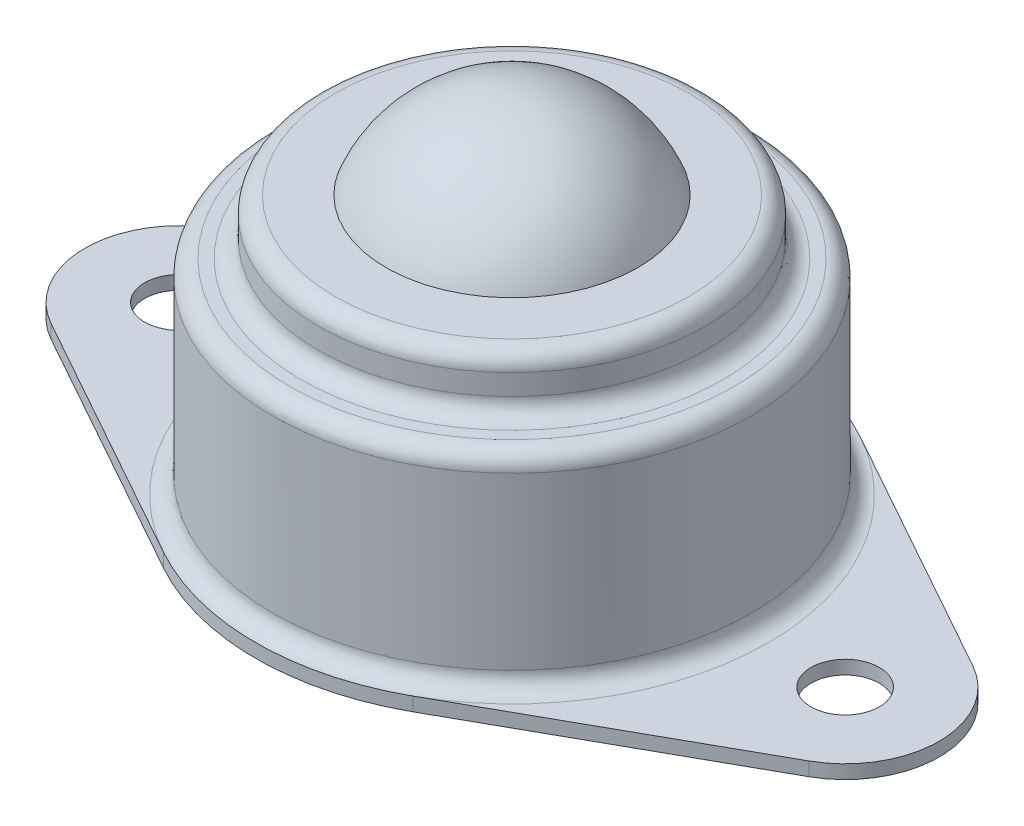
ISO-10303-21;
HEADER;
FILE_DESCRIPTION(('STEP AP214'),'2;1');
FILE_NAME('part.step','',(''),(''),'','','');
FILE_SCHEMA(('AUTOMOTIVE_DESIGN { 1 0 10303 214 1 1 1 1 }'));
ENDSEC;
DATA;
#1=APPLICATION_CONTEXT('core data for automotive mechanical design processes');
#2=APPLICATION_PROTOCOL_DEFINITION('international standard','automotive_design',2000,#1);
#3=PRODUCT_CONTEXT('',#1,'mechanical');
#4=PRODUCT('Part','Part','',(#3));
#5=PRODUCT_RELATED_PRODUCT_CATEGORY('part','',(#4));
#6=PRODUCT_DEFINITION_FORMATION('','',#4);
#7=PRODUCT_DEFINITION_CONTEXT('part definition',#1,'design');
#8=PRODUCT_DEFINITION('design','',#6,#7);
#9=PRODUCT_DEFINITION_SHAPE('','',#8);
#10=(LENGTH_UNIT() NAMED_UNIT(*) SI_UNIT(.MILLI.,.METRE.));
#11=(NAMED_UNIT(*) PLANE_ANGLE_UNIT() SI_UNIT($,.RADIAN.));
#12=(NAMED_UNIT(*) SI_UNIT($,.STERADIAN.) SOLID_ANGLE_UNIT());
#13=UNCERTAINTY_MEASURE_WITH_UNIT(LENGTH_MEASURE(1.E-05),#10,'distance_accuracy_value','');
#14=(GEOMETRIC_REPRESENTATION_CONTEXT(3) GLOBAL_UNCERTAINTY_ASSIGNED_CONTEXT((#13)) GLOBAL_UNIT_ASSIGNED_CONTEXT((#10,
#11,#12)) REPRESENTATION_CONTEXT('',''));
#15=CARTESIAN_POINT('',(0.,0.,0.));
#16=DIRECTION('',(0.,0.,1.));
#17=DIRECTION('',(1.,0.,0.));
#18=AXIS2_PLACEMENT_3D('',#15,#16,#17);
#19=CARTESIAN_POINT('',(0.,6.79310694197932,0.));
#20=DIRECTION('',(0.,-1.,0.));
#21=DIRECTION('',(-1.,0.,0.));
#22=AXIS2_PLACEMENT_3D('',#19,#20,#21);
#23=CYLINDRICAL_SURFACE('',#22,14.);
#24=CARTESIAN_POINT('',(0.,11.7862138839586,0.));
#25=DIRECTION('',(0.,1.,0.));
#26=DIRECTION('',(1.,0.,0.));
#27=AXIS2_PLACEMENT_3D('',#24,#25,#26);
#28=CIRCLE('',#27,14.);
#29=CARTESIAN_POINT('',(-14.,11.7862138839586,0.));
#30=VERTEX_POINT('',#29);
#31=EDGE_CURVE('E187',#30,#30,#28,.T.);
#32=ORIENTED_EDGE('',*,*,#31,.F.);
#33=EDGE_LOOP('',(#32));
#34=FACE_BOUND('',#33,.T.);
#35=CARTESIAN_POINT('',(0.,1.8,0.));
#36=DIRECTION('',(0.,1.,0.));
#37=DIRECTION('',(1.,0.,0.));
#38=AXIS2_PLACEMENT_3D('',#35,#36,#37);
#39=CIRCLE('',#38,14.);
#40=CARTESIAN_POINT('',(-14.,1.8,0.));
#41=VERTEX_POINT('',#40);
#42=EDGE_CURVE('E11',#41,#41,#39,.T.);
#43=ORIENTED_EDGE('',*,*,#42,.T.);
#44=EDGE_LOOP('',(#43));
#45=FACE_BOUND('',#44,.T.);
#46=ADVANCED_FACE('F17',(#34,#45),#23,.T.);
#47=CARTESIAN_POINT('',(0.,1.8,0.));
#48=DIRECTION('',(0.,1.,0.));
#49=DIRECTION('',(0.,0.,1.));
#50=AXIS2_PLACEMENT_3D('',#47,#48,#49);
#51=TOROIDAL_SURFACE('',#50,15.,1.);
#52=ORIENTED_EDGE('',*,*,#42,.F.);
#53=EDGE_LOOP('',(#52));
#54=FACE_BOUND('',#53,.T.);
#55=CARTESIAN_POINT('',(0.,0.800000000000012,0.));
#56=DIRECTION('',(0.,1.,0.));
#57=DIRECTION('',(1.,0.,0.));
#58=AXIS2_PLACEMENT_3D('',#55,#56,#57);
#59=CIRCLE('',#58,15.);
#60=CARTESIAN_POINT('',(-7.30769230769232,0.8,-13.0995279737895));
#61=VERTEX_POINT('',#60);
#62=CARTESIAN_POINT('',(-7.30769230769232,0.8,13.0995279737895));
#63=VERTEX_POINT('',#62);
#64=EDGE_CURVE('E152',#61,#63,#59,.T.);
#65=ORIENTED_EDGE('',*,*,#64,.T.);
#66=CARTESIAN_POINT('',(0.,0.800000000000012,0.));
#67=DIRECTION('',(0.,1.,0.));
#68=DIRECTION('',(1.,0.,0.));
#69=AXIS2_PLACEMENT_3D('',#66,#67,#68);
#70=CIRCLE('',#69,15.);
#71=CARTESIAN_POINT('',(7.30769230769231,0.800000000000018,13.0995279737895));
#72=VERTEX_POINT('',#71);
#73=EDGE_CURVE('E164',#63,#72,#70,.T.);
#74=ORIENTED_EDGE('',*,*,#73,.T.);
#75=CARTESIAN_POINT('',(0.,0.800000000000012,0.));
#76=DIRECTION('',(0.,1.,0.));
#77=DIRECTION('',(1.,0.,0.));
#78=AXIS2_PLACEMENT_3D('',#75,#76,#77);
#79=CIRCLE('',#78,15.);
#80=CARTESIAN_POINT('',(7.30769230769232,0.800000000000018,-13.0995279737895));
#81=VERTEX_POINT('',#80);
#82=EDGE_CURVE('E151',#72,#81,#79,.T.);
#83=ORIENTED_EDGE('',*,*,#82,.T.);
#84=CARTESIAN_POINT('',(0.,0.800000000000012,0.));
#85=DIRECTION('',(0.,1.,0.));
#86=DIRECTION('',(1.,0.,0.));
#87=AXIS2_PLACEMENT_3D('',#84,#85,#86);
#88=CIRCLE('',#87,15.);
#89=EDGE_CURVE('E173',#81,#61,#88,.T.);
#90=ORIENTED_EDGE('',*,*,#89,.T.);
#91=EDGE_LOOP('',(#65,#74,#83,#90));
#92=FACE_BOUND('',#91,.T.);
#93=ADVANCED_FACE('F277',(#54,#92),#51,.F.);
#94=CARTESIAN_POINT('',(-25.,0.,0.));
#95=DIRECTION('',(0.,-1.,0.));
#96=DIRECTION('',(0.,0.,-1.));
#97=AXIS2_PLACEMENT_3D('',#94,#95,#96);
#98=PLANE('',#97);
#99=CARTESIAN_POINT('',(0.,0.,0.));
#100=DIRECTION('',(0.,1.,0.));
#101=DIRECTION('',(1.,0.,0.));
#102=AXIS2_PLACEMENT_3D('',#99,#100,#101);
#103=CIRCLE('',#102,14.);
#104=CARTESIAN_POINT('',(-14.,0.,0.));
#105=VERTEX_POINT('',#104);
#106=EDGE_CURVE('E28',#105,#105,#103,.T.);
#107=ORIENTED_EDGE('',*,*,#106,.T.);
#108=EDGE_LOOP('',(#107));
#109=FACE_BOUND('',#108,.T.);
#110=CARTESIAN_POINT('',(-19.5,0.,0.));
#111=DIRECTION('',(0.,1.,0.));
#112=DIRECTION('',(1.,0.,0.));
#113=AXIS2_PLACEMENT_3D('',#110,#111,#112);
#114=CIRCLE('',#113,2.);
#115=CARTESIAN_POINT('',(-21.5,0.,0.));
#116=VERTEX_POINT('',#115);
#117=EDGE_CURVE('E211',#116,#116,#114,.T.);
#118=ORIENTED_EDGE('',*,*,#117,.T.);
#119=EDGE_LOOP('',(#118));
#120=FACE_BOUND('',#119,.T.);
#121=CARTESIAN_POINT('',(19.5,0.,0.));
#122=DIRECTION('',(0.,1.,0.));
#123=DIRECTION('',(1.,0.,0.));
#124=AXIS2_PLACEMENT_3D('',#121,#122,#123);
#125=CIRCLE('',#124,2.);
#126=CARTESIAN_POINT('',(17.5,0.,0.));
#127=VERTEX_POINT('',#126);
#128=EDGE_CURVE('E213',#127,#127,#125,.T.);
#129=ORIENTED_EDGE('',*,*,#128,.T.);
#130=EDGE_LOOP('',(#129));
#131=FACE_BOUND('',#130,.T.);
#132=CARTESIAN_POINT('',(19.5,0.,0.));
#133=DIRECTION('',(0.,-1.,0.));
#134=DIRECTION('',(-1.,0.,0.));
#135=AXIS2_PLACEMENT_3D('',#132,#133,#134);
#136=CIRCLE('',#135,5.5);
#137=CARTESIAN_POINT('',(22.1794871794872,0.,-4.80316025705616));
#138=VERTEX_POINT('',#137);
#139=CARTESIAN_POINT('',(22.1794871794872,0.,4.80316025705616));
#140=VERTEX_POINT('',#139);
#141=EDGE_CURVE('E147',#138,#140,#136,.T.);
#142=ORIENTED_EDGE('',*,*,#141,.T.);
#143=DIRECTION('',(-0.873301864919302,0.,0.487179487179488));
#144=VECTOR('',#143,1.);
#145=CARTESIAN_POINT('',(-2.22550953320183,0.,18.417712407593));
#146=LINE('',#145,#144);
#147=CARTESIAN_POINT('',(7.30769230769231,0.,13.0995279737895));
#148=VERTEX_POINT('',#147);
#149=EDGE_CURVE('E156',#140,#148,#146,.T.);
#150=ORIENTED_EDGE('',*,*,#149,.T.);
#151=CARTESIAN_POINT('',(0.,0.,0.));
#152=DIRECTION('',(0.,-1.,0.));
#153=DIRECTION('',(-1.,0.,0.));
#154=AXIS2_PLACEMENT_3D('',#151,#152,#153);
#155=CIRCLE('',#154,15.);
#156=CARTESIAN_POINT('',(-7.30769230769232,0.,13.0995279737895));
#157=VERTEX_POINT('',#156);
#158=EDGE_CURVE('E177',#148,#157,#155,.T.);
#159=ORIENTED_EDGE('',*,*,#158,.T.);
#160=DIRECTION('',(-0.873301864919302,0.,-0.487179487179488));
#161=VECTOR('',#160,1.);
#162=CARTESIAN_POINT('',(-24.2767915844839,0.,3.6331596816194));
#163=LINE('',#162,#161);
#164=CARTESIAN_POINT('',(-22.1794871794872,0.,4.80316025705616));
#165=VERTEX_POINT('',#164);
#166=EDGE_CURVE('E194',#157,#165,#163,.T.);
#167=ORIENTED_EDGE('',*,*,#166,.T.);
#168=CARTESIAN_POINT('',(-19.5,0.,0.));
#169=DIRECTION('',(0.,-1.,0.));
#170=DIRECTION('',(-1.,0.,0.));
#171=AXIS2_PLACEMENT_3D('',#168,#169,#170);
#172=CIRCLE('',#171,5.5);
#173=CARTESIAN_POINT('',(-22.1794871794872,0.,-4.80316025705616));
#174=VERTEX_POINT('',#173);
#175=EDGE_CURVE('E162',#165,#174,#172,.T.);
#176=ORIENTED_EDGE('',*,*,#175,.T.);
#177=DIRECTION('',(0.873301864919302,0.,-0.487179487179488));
#178=VECTOR('',#177,1.);
#179=CARTESIAN_POINT('',(-16.8408941485865,0.,-7.78134353998609));
#180=LINE('',#179,#178);
#181=CARTESIAN_POINT('',(-7.30769230769232,0.,-13.0995279737895));
#182=VERTEX_POINT('',#181);
#183=EDGE_CURVE('E181',#174,#182,#180,.T.);
#184=ORIENTED_EDGE('',*,*,#183,.T.);
#185=CARTESIAN_POINT('',(0.,0.,0.));
#186=DIRECTION('',(0.,-1.,0.));
#187=DIRECTION('',(-1.,0.,0.));
#188=AXIS2_PLACEMENT_3D('',#185,#186,#187);
#189=CIRCLE('',#188,15.);
#190=CARTESIAN_POINT('',(7.30769230769232,0.,-13.0995279737895));
#191=VERTEX_POINT('',#190);
#192=EDGE_CURVE('E174',#182,#191,#189,.T.);
#193=ORIENTED_EDGE('',*,*,#192,.T.);
#194=DIRECTION('',(0.873301864919302,0.,0.487179487179488));
#195=VECTOR('',#194,1.);
#196=CARTESIAN_POINT('',(5.2103879026956,0.,-14.2695285492263));
#197=LINE('',#196,#195);
#198=EDGE_CURVE('E180',#191,#138,#197,.T.);
#199=ORIENTED_EDGE('',*,*,#198,.T.);
#200=EDGE_LOOP('',(#142,#150,#159,#167,#176,#184,#193,#199));
#201=FACE_BOUND('',#200,.T.);
#202=ADVANCED_FACE('F256',(#109,#120,#131,#201),#98,.T.);
#203=CARTESIAN_POINT('',(0.,1.,0.));
#204=DIRECTION('',(0.,1.,0.));
#205=DIRECTION('',(0.,0.,1.));
#206=AXIS2_PLACEMENT_3D('',#203,#204,#205);
#207=TOROIDAL_SURFACE('',#206,14.,1.);
#208=ORIENTED_EDGE('',*,*,#106,.F.);
#209=EDGE_LOOP('',(#208));
#210=FACE_BOUND('',#209,.T.);
#211=CARTESIAN_POINT('',(0.,1.,0.));
#212=DIRECTION('',(0.,1.,0.));
#213=DIRECTION('',(1.,0.,0.));
#214=AXIS2_PLACEMENT_3D('',#211,#212,#213);
#215=CIRCLE('',#214,13.);
#216=CARTESIAN_POINT('',(-13.,1.,0.));
#217=VERTEX_POINT('',#216);
#218=EDGE_CURVE('E130',#217,#217,#215,.T.);
#219=ORIENTED_EDGE('',*,*,#218,.T.);
#220=EDGE_LOOP('',(#219));
#221=FACE_BOUND('',#220,.T.);
#222=ADVANCED_FACE('F131',(#210,#221),#207,.T.);
#223=CARTESIAN_POINT('',(0.,4.40011876752604,0.));
#224=DIRECTION('',(0.,-1.,0.));
#225=DIRECTION('',(-1.,0.,0.));
#226=AXIS2_PLACEMENT_3D('',#223,#224,#225);
#227=CYLINDRICAL_SURFACE('',#226,13.);
#228=ORIENTED_EDGE('',*,*,#218,.F.);
#229=EDGE_LOOP('',(#228));
#230=FACE_BOUND('',#229,.T.);
#231=CARTESIAN_POINT('',(0.,7.80023753505206,0.));
#232=DIRECTION('',(0.,1.,0.));
#233=DIRECTION('',(1.,0.,0.));
#234=AXIS2_PLACEMENT_3D('',#231,#232,#233);
#235=CIRCLE('',#234,13.);
#236=CARTESIAN_POINT('',(-13.,7.80023753505205,0.));
#237=VERTEX_POINT('',#236);
#238=EDGE_CURVE('E134',#237,#237,#235,.T.);
#239=ORIENTED_EDGE('',*,*,#238,.T.);
#240=EDGE_LOOP('',(#239));
#241=FACE_BOUND('',#240,.T.);
#242=ADVANCED_FACE('F344',(#230,#241),#227,.F.);
#243=CARTESIAN_POINT('',(0.,7.80023753505206,0.));
#244=DIRECTION('',(0.,1.,0.));
#245=DIRECTION('',(0.,0.,1.));
#246=AXIS2_PLACEMENT_3D('',#243,#244,#245);
#247=TOROIDAL_SURFACE('',#246,12.5,0.5);
#248=ORIENTED_EDGE('',*,*,#238,.F.);
#249=EDGE_LOOP('',(#248));
#250=FACE_BOUND('',#249,.T.);
#251=CARTESIAN_POINT('',(0.,7.99423799458932,0.));
#252=DIRECTION('',(0.,1.,0.));
#253=DIRECTION('',(1.,0.,0.));
#254=AXIS2_PLACEMENT_3D('',#251,#252,#253);
#255=CIRCLE('',#254,12.0391705069124);
#256=CARTESIAN_POINT('',(-12.0391705069125,7.99423799458931,0.));
#257=VERTEX_POINT('',#256);
#258=EDGE_CURVE('E143',#257,#257,#255,.T.);
#259=ORIENTED_EDGE('',*,*,#258,.T.);
#260=EDGE_LOOP('',(#259));
#261=FACE_BOUND('',#260,.T.);
#262=ADVANCED_FACE('F339',(#250,#261),#247,.F.);
#263=CARTESIAN_POINT('',(0.,13.0625,0.));
#264=DIRECTION('',(0.,0.,1.));
#265=DIRECTION('',(1.,0.,0.));
#266=AXIS2_PLACEMENT_3D('',#263,#264,#265);
#267=SPHERICAL_SURFACE('',#266,13.0625);
#268=CARTESIAN_POINT('',(0.,13.0625,0.));
#269=DIRECTION('',(0.,1.,0.));
#270=DIRECTION('',(1.,0.,0.));
#271=AXIS2_PLACEMENT_3D('',#268,#269,#270);
#272=SPHERICAL_SURFACE('',#271,13.0625);
#273=ORIENTED_EDGE('',*,*,#258,.F.);
#274=EDGE_LOOP('',(#273));
#275=FACE_BOUND('',#274,.T.);
#276=ADVANCED_FACE('F300',(#275),#272,.T.);
#277=CARTESIAN_POINT('',(0.,16.,0.));
#278=DIRECTION('',(0.,1.,0.));
#279=DIRECTION('',(0.,0.,1.));
#280=AXIS2_PLACEMENT_3D('',#277,#278,#279);
#281=PLANE('',#280);
#282=CARTESIAN_POINT('',(0.,16.,0.));
#283=DIRECTION('',(0.,1.,0.));
#284=DIRECTION('',(1.,0.,0.));
#285=AXIS2_PLACEMENT_3D('',#282,#283,#284);
#286=CIRCLE('',#285,10.3292707903072);
#287=CARTESIAN_POINT('',(-10.3292707903072,16.,0.));
#288=VERTEX_POINT('',#287);
#289=EDGE_CURVE('E21',#288,#288,#286,.T.);
#290=ORIENTED_EDGE('',*,*,#289,.T.);
#291=EDGE_LOOP('',(#290));
#292=FACE_BOUND('',#291,.T.);
#293=CARTESIAN_POINT('',(0.,16.,0.));
#294=DIRECTION('',(0.,-1.,0.));
#295=DIRECTION('',(0.,0.,-1.));
#296=AXIS2_PLACEMENT_3D('',#293,#294,#295);
#297=CIRCLE('',#296,7.37413976338937);
#298=CARTESIAN_POINT('',(7.37413976338935,16.,0.));
#299=VERTEX_POINT('',#298);
#300=EDGE_CURVE('E175',#299,#299,#297,.T.);
#301=ORIENTED_EDGE('',*,*,#300,.T.);
#302=EDGE_LOOP('',(#301));
#303=FACE_BOUND('',#302,.T.);
#304=ADVANCED_FACE('F291',(#292,#303),#281,.T.);
#305=CARTESIAN_POINT('',(0.,15.,0.));
#306=DIRECTION('',(0.,1.,0.));
#307=DIRECTION('',(0.,0.,1.));
#308=AXIS2_PLACEMENT_3D('',#305,#306,#307);
#309=TOROIDAL_SURFACE('',#308,10.3292707903072,1.);
#310=ORIENTED_EDGE('',*,*,#289,.F.);
#311=EDGE_LOOP('',(#310));
#312=FACE_BOUND('',#311,.T.);
#313=CARTESIAN_POINT('',(0.,15.,0.));
#314=DIRECTION('',(0.,1.,0.));
#315=DIRECTION('',(1.,0.,0.));
#316=AXIS2_PLACEMENT_3D('',#313,#314,#315);
#317=CIRCLE('',#316,11.3292707903072);
#318=CARTESIAN_POINT('',(-11.3292707903072,15.,0.));
#319=VERTEX_POINT('',#318);
#320=EDGE_CURVE('E198',#319,#319,#317,.T.);
#321=ORIENTED_EDGE('',*,*,#320,.T.);
#322=EDGE_LOOP('',(#321));
#323=FACE_BOUND('',#322,.T.);
#324=ADVANCED_FACE('F288',(#312,#323),#309,.T.);
#325=CARTESIAN_POINT('',(0.,14.3931069419793,0.));
#326=DIRECTION('',(0.,-1.,0.));
#327=DIRECTION('',(-1.,0.,0.));
#328=AXIS2_PLACEMENT_3D('',#325,#326,#327);
#329=CYLINDRICAL_SURFACE('',#328,11.3292707903072);
#330=ORIENTED_EDGE('',*,*,#320,.F.);
#331=EDGE_LOOP('',(#330));
#332=FACE_BOUND('',#331,.T.);
#333=CARTESIAN_POINT('',(0.,13.7862138839586,0.));
#334=DIRECTION('',(0.,1.,0.));
#335=DIRECTION('',(1.,0.,0.));
#336=AXIS2_PLACEMENT_3D('',#333,#334,#335);
#337=CIRCLE('',#336,11.3292707903072);
#338=CARTESIAN_POINT('',(-11.3292707903073,13.7862138839586,0.));
#339=VERTEX_POINT('',#338);
#340=EDGE_CURVE('E200',#339,#339,#337,.T.);
#341=ORIENTED_EDGE('',*,*,#340,.T.);
#342=EDGE_LOOP('',(#341));
#343=FACE_BOUND('',#342,.T.);
#344=ADVANCED_FACE('F290',(#332,#343),#329,.T.);
#345=CARTESIAN_POINT('',(0.,13.7862138839586,0.));
#346=DIRECTION('',(0.,1.,0.));
#347=DIRECTION('',(0.,0.,1.));
#348=AXIS2_PLACEMENT_3D('',#345,#346,#347);
#349=TOROIDAL_SURFACE('',#348,12.3292707903072,1.);
#350=ORIENTED_EDGE('',*,*,#340,.F.);
#351=EDGE_LOOP('',(#350));
#352=FACE_BOUND('',#351,.T.);
#353=CARTESIAN_POINT('',(0.,12.7862138839586,0.));
#354=DIRECTION('',(0.,1.,0.));
#355=DIRECTION('',(1.,0.,0.));
#356=AXIS2_PLACEMENT_3D('',#353,#354,#355);
#357=CIRCLE('',#356,12.3292707903072);
#358=CARTESIAN_POINT('',(-12.3292707903072,12.7862138839586,0.));
#359=VERTEX_POINT('',#358);
#360=EDGE_CURVE('E112',#359,#359,#357,.T.);
#361=ORIENTED_EDGE('',*,*,#360,.T.);
#362=EDGE_LOOP('',(#361));
#363=FACE_BOUND('',#362,.T.);
#364=ADVANCED_FACE('F297',(#352,#363),#349,.F.);
#365=CARTESIAN_POINT('',(-12.3292707903072,12.7862138839586,0.));
#366=DIRECTION('',(0.,1.,0.));
#367=DIRECTION('',(0.,0.,1.));
#368=AXIS2_PLACEMENT_3D('',#365,#366,#367);
#369=PLANE('',#368);
#370=ORIENTED_EDGE('',*,*,#360,.F.);
#371=EDGE_LOOP('',(#370));
#372=FACE_BOUND('',#371,.T.);
#373=CARTESIAN_POINT('',(0.,12.7862138839586,0.));
#374=DIRECTION('',(0.,1.,0.));
#375=DIRECTION('',(1.,0.,0.));
#376=AXIS2_PLACEMENT_3D('',#373,#374,#375);
#377=CIRCLE('',#376,13.);
#378=CARTESIAN_POINT('',(-13.,12.7862138839586,0.));
#379=VERTEX_POINT('',#378);
#380=EDGE_CURVE('E108',#379,#379,#377,.T.);
#381=ORIENTED_EDGE('',*,*,#380,.T.);
#382=EDGE_LOOP('',(#381));
#383=FACE_BOUND('',#382,.T.);
#384=ADVANCED_FACE('F310',(#372,#383),#369,.T.);
#385=CARTESIAN_POINT('',(0.,11.7862138839586,0.));
#386=DIRECTION('',(0.,1.,0.));
#387=DIRECTION('',(0.,0.,1.));
#388=AXIS2_PLACEMENT_3D('',#385,#386,#387);
#389=TOROIDAL_SURFACE('',#388,13.,1.);
#390=ORIENTED_EDGE('',*,*,#380,.F.);
#391=EDGE_LOOP('',(#390));
#392=FACE_BOUND('',#391,.T.);
#393=ORIENTED_EDGE('',*,*,#31,.T.);
#394=EDGE_LOOP('',(#393));
#395=FACE_BOUND('',#394,.T.);
#396=ADVANCED_FACE('F271',(#392,#395),#389,.T.);
#397=CARTESIAN_POINT('',(-19.5,0.8,0.));
#398=DIRECTION('',(0.,1.,0.));
#399=DIRECTION('',(1.,0.,0.));
#400=AXIS2_PLACEMENT_3D('',#397,#398,#399);
#401=CYLINDRICAL_SURFACE('',#400,2.);
#402=CARTESIAN_POINT('',(-19.5,0.8,0.));
#403=DIRECTION('',(0.,-1.,0.));
#404=DIRECTION('',(1.,0.,0.));
#405=AXIS2_PLACEMENT_3D('',#402,#403,#404);
#406=CIRCLE('',#405,2.);
#407=CARTESIAN_POINT('',(-17.5,0.8,0.));
#408=VERTEX_POINT('',#407);
#409=EDGE_CURVE('E205',#408,#408,#406,.T.);
#410=ORIENTED_EDGE('',*,*,#409,.F.);
#411=EDGE_LOOP('',(#410));
#412=FACE_BOUND('',#411,.T.);
#413=ORIENTED_EDGE('',*,*,#117,.F.);
#414=EDGE_LOOP('',(#413));
#415=FACE_BOUND('',#414,.T.);
#416=ADVANCED_FACE('F19',(#412,#415),#401,.F.);
#417=CARTESIAN_POINT('',(19.5,0.800000000000028,0.));
#418=DIRECTION('',(0.,1.,0.));
#419=DIRECTION('',(1.,0.,0.));
#420=AXIS2_PLACEMENT_3D('',#417,#418,#419);
#421=CYLINDRICAL_SURFACE('',#420,2.);
#422=CARTESIAN_POINT('',(19.5,0.80000000000003,0.));
#423=DIRECTION('',(0.,-1.,0.));
#424=DIRECTION('',(1.,0.,0.));
#425=AXIS2_PLACEMENT_3D('',#422,#423,#424);
#426=CIRCLE('',#425,2.);
#427=CARTESIAN_POINT('',(21.5,0.80000000000003,0.));
#428=VERTEX_POINT('',#427);
#429=EDGE_CURVE('E149',#428,#428,#426,.T.);
#430=ORIENTED_EDGE('',*,*,#429,.F.);
#431=EDGE_LOOP('',(#430));
#432=FACE_BOUND('',#431,.T.);
#433=ORIENTED_EDGE('',*,*,#128,.F.);
#434=EDGE_LOOP('',(#433));
#435=FACE_BOUND('',#434,.T.);
#436=ADVANCED_FACE('F258',(#432,#435),#421,.F.);
#437=CARTESIAN_POINT('',(-15.,0.8,0.));
#438=DIRECTION('',(0.,1.,0.));
#439=DIRECTION('',(0.,0.,1.));
#440=AXIS2_PLACEMENT_3D('',#437,#438,#439);
#441=PLANE('',#440);
#442=DIRECTION('',(0.873301864919302,0.,-0.487179487179488));
#443=VECTOR('',#442,1.);
#444=CARTESIAN_POINT('',(1.58777120315583,0.800000000000014,16.2904386340716));
#445=LINE('',#444,#443);
#446=CARTESIAN_POINT('',(22.1794871794872,0.800000000000031,4.80316025705616));
#447=VERTEX_POINT('',#446);
#448=EDGE_CURVE('E203',#72,#447,#445,.T.);
#449=ORIENTED_EDGE('',*,*,#448,.T.);
#450=CARTESIAN_POINT('',(19.5,0.8,0.));
#451=DIRECTION('',(0.,1.,0.));
#452=DIRECTION('',(-1.,0.,0.));
#453=AXIS2_PLACEMENT_3D('',#450,#451,#452);
#454=CIRCLE('',#453,5.5);
#455=CARTESIAN_POINT('',(22.1794871794872,0.800000000000031,-4.80316025705616));
#456=VERTEX_POINT('',#455);
#457=EDGE_CURVE('E157',#447,#456,#454,.T.);
#458=ORIENTED_EDGE('',*,*,#457,.T.);
#459=DIRECTION('',(-0.873301864919302,0.,-0.487179487179488));
#460=VECTOR('',#459,1.);
#461=CARTESIAN_POINT('',(9.02366863905326,0.80000000000002,-12.1422547757049));
#462=LINE('',#461,#460);
#463=EDGE_CURVE('E163',#456,#81,#462,.T.);
#464=ORIENTED_EDGE('',*,*,#463,.T.);
#465=ORIENTED_EDGE('',*,*,#82,.F.);
#466=EDGE_LOOP('',(#449,#458,#464,#465));
#467=FACE_BOUND('',#466,.T.);
#468=ORIENTED_EDGE('',*,*,#429,.T.);
#469=EDGE_LOOP('',(#468));
#470=FACE_BOUND('',#469,.T.);
#471=ADVANCED_FACE('F260',(#467,#470),#441,.T.);
#472=CARTESIAN_POINT('',(-15.,0.8,0.));
#473=DIRECTION('',(0.,1.,0.));
#474=DIRECTION('',(0.,0.,1.));
#475=AXIS2_PLACEMENT_3D('',#472,#473,#474);
#476=PLANE('',#475);
#477=DIRECTION('',(0.873301864919302,0.,0.487179487179488));
#478=VECTOR('',#477,1.);
#479=CARTESIAN_POINT('',(-20.4635108481263,0.8,5.76043345514078));
#480=LINE('',#479,#478);
#481=CARTESIAN_POINT('',(-22.1794871794872,0.8,4.80316025705616));
#482=VERTEX_POINT('',#481);
#483=EDGE_CURVE('E197',#482,#63,#480,.T.);
#484=ORIENTED_EDGE('',*,*,#483,.T.);
#485=ORIENTED_EDGE('',*,*,#64,.F.);
#486=DIRECTION('',(-0.873301864919302,0.,0.487179487179488));
#487=VECTOR('',#486,1.);
#488=CARTESIAN_POINT('',(-13.0276134122288,0.8,-9.90861731350747));
#489=LINE('',#488,#487);
#490=CARTESIAN_POINT('',(-22.1794871794872,0.8,-4.80316025705616));
#491=VERTEX_POINT('',#490);
#492=EDGE_CURVE('E183',#61,#491,#489,.T.);
#493=ORIENTED_EDGE('',*,*,#492,.T.);
#494=CARTESIAN_POINT('',(-19.5,0.8,0.));
#495=DIRECTION('',(0.,1.,0.));
#496=DIRECTION('',(-1.,0.,0.));
#497=AXIS2_PLACEMENT_3D('',#494,#495,#496);
#498=CIRCLE('',#497,5.5);
#499=EDGE_CURVE('E210',#491,#482,#498,.T.);
#500=ORIENTED_EDGE('',*,*,#499,.T.);
#501=EDGE_LOOP('',(#484,#485,#493,#500));
#502=FACE_BOUND('',#501,.T.);
#503=ORIENTED_EDGE('',*,*,#409,.T.);
#504=EDGE_LOOP('',(#503));
#505=FACE_BOUND('',#504,.T.);
#506=ADVANCED_FACE('F268',(#502,#505),#476,.T.);
#507=CARTESIAN_POINT('',(7.30769230769231,0.800000000000018,13.0995279737895));
#508=DIRECTION('',(-0.487179487179488,0.,-0.873301864919303));
#509=DIRECTION('',(0.873301864919302,0.,-0.487179487179488));
#510=AXIS2_PLACEMENT_3D('',#507,#508,#509);
#511=PLANE('',#510);
#512=ORIENTED_EDGE('',*,*,#149,.F.);
#513=DIRECTION('',(0.,-1.,0.));
#514=VECTOR('',#513,1.);
#515=CARTESIAN_POINT('',(22.1794871794872,0.800000000000031,4.80316025705616));
#516=LINE('',#515,#514);
#517=EDGE_CURVE('E153',#447,#140,#516,.T.);
#518=ORIENTED_EDGE('',*,*,#517,.F.);
#519=ORIENTED_EDGE('',*,*,#448,.F.);
#520=DIRECTION('',(0.,-1.,0.));
#521=VECTOR('',#520,1.);
#522=CARTESIAN_POINT('',(7.30769230769231,0.800000000000018,13.0995279737895));
#523=LINE('',#522,#521);
#524=EDGE_CURVE('E168',#72,#148,#523,.T.);
#525=ORIENTED_EDGE('',*,*,#524,.T.);
#526=EDGE_LOOP('',(#512,#518,#519,#525));
#527=FACE_BOUND('',#526,.T.);
#528=ADVANCED_FACE('F287',(#527),#511,.F.);
#529=CARTESIAN_POINT('',(19.5,0.800000000000028,0.));
#530=DIRECTION('',(0.,1.,0.));
#531=DIRECTION('',(-1.,0.,0.));
#532=AXIS2_PLACEMENT_3D('',#529,#530,#531);
#533=CYLINDRICAL_SURFACE('',#532,5.5);
#534=ORIENTED_EDGE('',*,*,#141,.F.);
#535=DIRECTION('',(0.,-1.,0.));
#536=VECTOR('',#535,1.);
#537=CARTESIAN_POINT('',(22.1794871794872,0.800000000000031,-4.80316025705616));
#538=LINE('',#537,#536);
#539=EDGE_CURVE('E158',#456,#138,#538,.T.);
#540=ORIENTED_EDGE('',*,*,#539,.F.);
#541=ORIENTED_EDGE('',*,*,#457,.F.);
#542=ORIENTED_EDGE('',*,*,#517,.T.);
#543=EDGE_LOOP('',(#534,#540,#541,#542));
#544=FACE_BOUND('',#543,.T.);
#545=ADVANCED_FACE('F318',(#544),#533,.T.);
#546=CARTESIAN_POINT('',(-7.30769230769232,0.8,-13.0995279737895));
#547=DIRECTION('',(0.487179487179488,0.,0.873301864919303));
#548=DIRECTION('',(-0.873301864919302,0.,0.487179487179488));
#549=AXIS2_PLACEMENT_3D('',#546,#547,#548);
#550=PLANE('',#549);
#551=ORIENTED_EDGE('',*,*,#183,.F.);
#552=DIRECTION('',(0.,-1.,0.));
#553=VECTOR('',#552,1.);
#554=CARTESIAN_POINT('',(-22.1794871794872,0.8,-4.80316025705616));
#555=LINE('',#554,#553);
#556=EDGE_CURVE('E184',#491,#174,#555,.T.);
#557=ORIENTED_EDGE('',*,*,#556,.F.);
#558=ORIENTED_EDGE('',*,*,#492,.F.);
#559=DIRECTION('',(0.,-1.,0.));
#560=VECTOR('',#559,1.);
#561=CARTESIAN_POINT('',(-7.30769230769232,0.8,-13.0995279737895));
#562=LINE('',#561,#560);
#563=EDGE_CURVE('E169',#61,#182,#562,.T.);
#564=ORIENTED_EDGE('',*,*,#563,.T.);
#565=EDGE_LOOP('',(#551,#557,#558,#564));
#566=FACE_BOUND('',#565,.T.);
#567=ADVANCED_FACE('F334',(#566),#550,.F.);
#568=CARTESIAN_POINT('',(-19.5,0.8,0.));
#569=DIRECTION('',(0.,1.,0.));
#570=DIRECTION('',(-1.,0.,0.));
#571=AXIS2_PLACEMENT_3D('',#568,#569,#570);
#572=CYLINDRICAL_SURFACE('',#571,5.5);
#573=ORIENTED_EDGE('',*,*,#175,.F.);
#574=DIRECTION('',(0.,-1.,0.));
#575=VECTOR('',#574,1.);
#576=CARTESIAN_POINT('',(-22.1794871794872,0.8,4.80316025705616));
#577=LINE('',#576,#575);
#578=EDGE_CURVE('E233',#482,#165,#577,.T.);
#579=ORIENTED_EDGE('',*,*,#578,.F.);
#580=ORIENTED_EDGE('',*,*,#499,.F.);
#581=ORIENTED_EDGE('',*,*,#556,.T.);
#582=EDGE_LOOP('',(#573,#579,#580,#581));
#583=FACE_BOUND('',#582,.T.);
#584=ADVANCED_FACE('F323',(#583),#572,.T.);
#585=CARTESIAN_POINT('',(22.1794871794872,0.800000000000031,-4.80316025705616));
#586=DIRECTION('',(-0.487179487179488,0.,0.873301864919303));
#587=DIRECTION('',(-0.873301864919302,0.,-0.487179487179488));
#588=AXIS2_PLACEMENT_3D('',#585,#586,#587);
#589=PLANE('',#588);
#590=ORIENTED_EDGE('',*,*,#198,.F.);
#591=DIRECTION('',(0.,-1.,0.));
#592=VECTOR('',#591,1.);
#593=CARTESIAN_POINT('',(7.30769230769232,0.800000000000018,-13.0995279737895));
#594=LINE('',#593,#592);
#595=EDGE_CURVE('E188',#81,#191,#594,.T.);
#596=ORIENTED_EDGE('',*,*,#595,.F.);
#597=ORIENTED_EDGE('',*,*,#463,.F.);
#598=ORIENTED_EDGE('',*,*,#539,.T.);
#599=EDGE_LOOP('',(#590,#596,#597,#598));
#600=FACE_BOUND('',#599,.T.);
#601=ADVANCED_FACE('F319',(#600),#589,.F.);
#602=CARTESIAN_POINT('',(0.,0.800000000000012,0.));
#603=DIRECTION('',(0.,1.,0.));
#604=DIRECTION('',(-1.,0.,0.));
#605=AXIS2_PLACEMENT_3D('',#602,#603,#604);
#606=CYLINDRICAL_SURFACE('',#605,15.);
#607=ORIENTED_EDGE('',*,*,#192,.F.);
#608=ORIENTED_EDGE('',*,*,#563,.F.);
#609=ORIENTED_EDGE('',*,*,#89,.F.);
#610=ORIENTED_EDGE('',*,*,#595,.T.);
#611=EDGE_LOOP('',(#607,#608,#609,#610));
#612=FACE_BOUND('',#611,.T.);
#613=ADVANCED_FACE('F322',(#612),#606,.T.);
#614=CARTESIAN_POINT('',(-22.1794871794872,0.8,4.80316025705616));
#615=DIRECTION('',(0.487179487179488,0.,-0.873301864919303));
#616=DIRECTION('',(0.873301864919302,0.,0.487179487179488));
#617=AXIS2_PLACEMENT_3D('',#614,#615,#616);
#618=PLANE('',#617);
#619=ORIENTED_EDGE('',*,*,#166,.F.);
#620=DIRECTION('',(0.,-1.,0.));
#621=VECTOR('',#620,1.);
#622=CARTESIAN_POINT('',(-7.30769230769232,0.8,13.0995279737895));
#623=LINE('',#622,#621);
#624=EDGE_CURVE('E167',#63,#157,#623,.T.);
#625=ORIENTED_EDGE('',*,*,#624,.F.);
#626=ORIENTED_EDGE('',*,*,#483,.F.);
#627=ORIENTED_EDGE('',*,*,#578,.T.);
#628=EDGE_LOOP('',(#619,#625,#626,#627));
#629=FACE_BOUND('',#628,.T.);
#630=ADVANCED_FACE('F330',(#629),#618,.F.);
#631=CARTESIAN_POINT('',(0.,0.800000000000012,0.));
#632=DIRECTION('',(0.,1.,0.));
#633=DIRECTION('',(-1.,0.,0.));
#634=AXIS2_PLACEMENT_3D('',#631,#632,#633);
#635=CYLINDRICAL_SURFACE('',#634,15.);
#636=ORIENTED_EDGE('',*,*,#158,.F.);
#637=ORIENTED_EDGE('',*,*,#524,.F.);
#638=ORIENTED_EDGE('',*,*,#73,.F.);
#639=ORIENTED_EDGE('',*,*,#624,.T.);
#640=EDGE_LOOP('',(#636,#637,#638,#639));
#641=FACE_BOUND('',#640,.T.);
#642=ADVANCED_FACE('F328',(#641),#635,.T.);
#643=CARTESIAN_POINT('',(0.,13.063,0.));
#644=DIRECTION('',(0.,0.,1.));
#645=DIRECTION('',(1.,0.,0.));
#646=AXIS2_PLACEMENT_3D('',#643,#644,#645);
#647=SPHERICAL_SURFACE('',#646,7.9375);
#648=CARTESIAN_POINT('',(0.,13.063,0.));
#649=DIRECTION('',(0.,-1.,0.));
#650=DIRECTION('',(0.,0.,-1.));
#651=AXIS2_PLACEMENT_3D('',#648,#649,#650);
#652=SPHERICAL_SURFACE('',#651,7.9375);
#653=ORIENTED_EDGE('',*,*,#300,.F.);
#654=EDGE_LOOP('',(#653));
#655=FACE_BOUND('',#654,.T.);
#656=ADVANCED_FACE('F325',(#655),#652,.T.);
#657=CLOSED_SHELL('',(#46,#93,#202,#222,#242,#262,#276,#304,#324,#344,#364,#384,#396,#416,#436,
#471,#506,#528,#545,#567,#584,#601,#613,#630,#642,#656));
#658=MANIFOLD_SOLID_BREP('B1',#657);
#659=ADVANCED_BREP_SHAPE_REPRESENTATION('',(#18,#658),#14);
#660=SHAPE_DEFINITION_REPRESENTATION(#9,#659);
ENDSEC;
END-ISO-10303-21;
